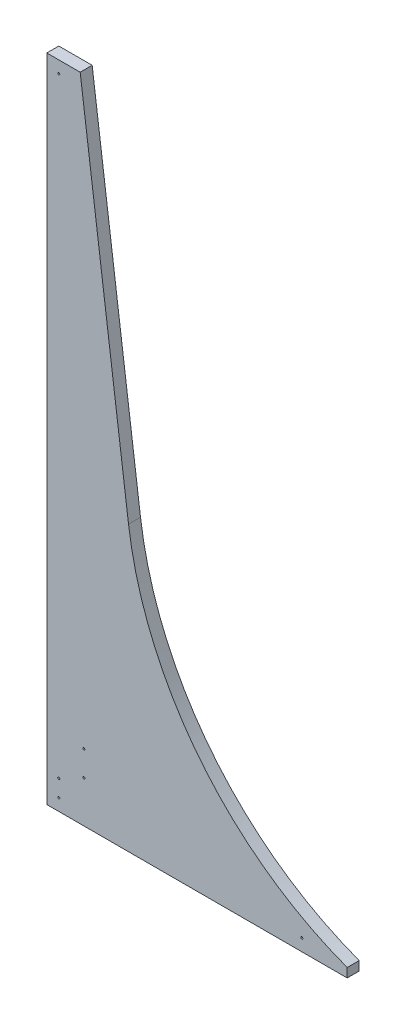
ISO-10303-21;
HEADER;
FILE_DESCRIPTION(('STEP AP214'),'2;1');
FILE_NAME('part.step','',(''),(''),'','','');
FILE_SCHEMA(('AUTOMOTIVE_DESIGN { 1 0 10303 214 1 1 1 1 }'));
ENDSEC;
DATA;
#1=APPLICATION_CONTEXT('core data for automotive mechanical design processes');
#2=APPLICATION_PROTOCOL_DEFINITION('international standard','automotive_design',2000,#1);
#3=PRODUCT_CONTEXT('',#1,'mechanical');
#4=PRODUCT('Part','Part','',(#3));
#5=PRODUCT_RELATED_PRODUCT_CATEGORY('part','',(#4));
#6=PRODUCT_DEFINITION_FORMATION('','',#4);
#7=PRODUCT_DEFINITION_CONTEXT('part definition',#1,'design');
#8=PRODUCT_DEFINITION('design','',#6,#7);
#9=PRODUCT_DEFINITION_SHAPE('','',#8);
#10=(LENGTH_UNIT() NAMED_UNIT(*) SI_UNIT(.MILLI.,.METRE.));
#11=(NAMED_UNIT(*) PLANE_ANGLE_UNIT() SI_UNIT($,.RADIAN.));
#12=(NAMED_UNIT(*) SI_UNIT($,.STERADIAN.) SOLID_ANGLE_UNIT());
#13=UNCERTAINTY_MEASURE_WITH_UNIT(LENGTH_MEASURE(1.E-05),#10,'distance_accuracy_value','');
#14=(GEOMETRIC_REPRESENTATION_CONTEXT(3) GLOBAL_UNCERTAINTY_ASSIGNED_CONTEXT((#13)) GLOBAL_UNIT_ASSIGNED_CONTEXT((#10,
#11,#12)) REPRESENTATION_CONTEXT('',''));
#15=CARTESIAN_POINT('',(0.,0.,0.));
#16=DIRECTION('',(0.,0.,1.));
#17=DIRECTION('',(1.,0.,0.));
#18=AXIS2_PLACEMENT_3D('',#15,#16,#17);
#19=CARTESIAN_POINT('',(638.116559349375,499.436357901165,18.25625));
#20=DIRECTION('',(0.,0.,-1.));
#21=DIRECTION('',(-1.,0.,0.));
#22=AXIS2_PLACEMENT_3D('',#19,#20,#21);
#23=CYLINDRICAL_SURFACE('',#22,518.182264806593);
#24=CARTESIAN_POINT('',(638.116559349375,499.436357901165,0.));
#25=DIRECTION('',(0.,0.,1.));
#26=DIRECTION('',(1.,0.,0.));
#27=AXIS2_PLACEMENT_3D('',#24,#25,#26);
#28=CIRCLE('',#27,518.182264806593);
#29=CARTESIAN_POINT('',(124.367415651835,431.8,0.));
#30=VERTEX_POINT('',#29);
#31=CARTESIAN_POINT('',(457.201,13.8620382080899,0.));
#32=VERTEX_POINT('',#31);
#33=EDGE_CURVE('E142',#30,#32,#28,.T.);
#34=ORIENTED_EDGE('',*,*,#33,.F.);
#35=DIRECTION('',(0.,0.,-1.));
#36=VECTOR('',#35,1.);
#37=CARTESIAN_POINT('',(124.367415651835,431.8,18.25625));
#38=LINE('',#37,#36);
#39=CARTESIAN_POINT('',(124.367415651835,431.8,18.25625));
#40=VERTEX_POINT('',#39);
#41=EDGE_CURVE('E11',#40,#30,#38,.T.);
#42=ORIENTED_EDGE('',*,*,#41,.F.);
#43=CARTESIAN_POINT('',(638.116559349375,499.436357901165,18.25625));
#44=DIRECTION('',(0.,0.,1.));
#45=DIRECTION('',(1.,0.,0.));
#46=AXIS2_PLACEMENT_3D('',#43,#44,#45);
#47=CIRCLE('',#46,518.182264806593);
#48=CARTESIAN_POINT('',(457.201,13.8620382080899,18.25625));
#49=VERTEX_POINT('',#48);
#50=EDGE_CURVE('E174',#40,#49,#47,.T.);
#51=ORIENTED_EDGE('',*,*,#50,.T.);
#52=DIRECTION('',(0.,0.,-1.));
#53=VECTOR('',#52,1.);
#54=CARTESIAN_POINT('',(457.201,13.8620382080899,18.25625));
#55=LINE('',#54,#53);
#56=EDGE_CURVE('E56',#49,#32,#55,.T.);
#57=ORIENTED_EDGE('',*,*,#56,.T.);
#58=EDGE_LOOP('',(#34,#42,#51,#57));
#59=FACE_BOUND('',#58,.T.);
#60=ADVANCED_FACE('F40',(#59),#23,.F.);
#61=CARTESIAN_POINT('',(178.127589027018,23.4509419846275,18.25625));
#62=DIRECTION('',(0.991444861373811,0.130526192220048,0.));
#63=DIRECTION('',(-0.130526192220048,0.991444861373811,0.));
#64=AXIS2_PLACEMENT_3D('',#61,#62,#63);
#65=PLANE('',#64);
#66=DIRECTION('',(0.130526192220048,-0.991444861373811,0.));
#67=VECTOR('',#66,1.);
#68=CARTESIAN_POINT('',(178.127589027018,23.4509419846275,0.));
#69=LINE('',#68,#67);
#70=CARTESIAN_POINT('',(50.8,990.6,0.));
#71=VERTEX_POINT('',#70);
#72=EDGE_CURVE('E144',#71,#30,#69,.T.);
#73=ORIENTED_EDGE('',*,*,#72,.F.);
#74=DIRECTION('',(0.,0.,-1.));
#75=VECTOR('',#74,1.);
#76=CARTESIAN_POINT('',(50.8,990.6,18.25625));
#77=LINE('',#76,#75);
#78=CARTESIAN_POINT('',(50.8,990.6,18.25625));
#79=VERTEX_POINT('',#78);
#80=EDGE_CURVE('E48',#79,#71,#77,.T.);
#81=ORIENTED_EDGE('',*,*,#80,.F.);
#82=DIRECTION('',(0.130526192220048,-0.991444861373811,0.));
#83=VECTOR('',#82,1.);
#84=CARTESIAN_POINT('',(178.127589027018,23.4509419846275,18.25625));
#85=LINE('',#84,#83);
#86=EDGE_CURVE('E119',#79,#40,#85,.T.);
#87=ORIENTED_EDGE('',*,*,#86,.T.);
#88=ORIENTED_EDGE('',*,*,#41,.T.);
#89=EDGE_LOOP('',(#73,#81,#87,#88));
#90=FACE_BOUND('',#89,.T.);
#91=ADVANCED_FACE('F183',(#90),#65,.T.);
#92=CARTESIAN_POINT('',(0.,990.6,18.25625));
#93=DIRECTION('',(0.,1.,0.));
#94=DIRECTION('',(0.,0.,1.));
#95=AXIS2_PLACEMENT_3D('',#92,#93,#94);
#96=PLANE('',#95);
#97=DIRECTION('',(1.,0.,0.));
#98=VECTOR('',#97,1.);
#99=CARTESIAN_POINT('',(0.,990.6,0.));
#100=LINE('',#99,#98);
#101=CARTESIAN_POINT('',(0.,990.6,0.));
#102=VERTEX_POINT('',#101);
#103=EDGE_CURVE('E147',#102,#71,#100,.T.);
#104=ORIENTED_EDGE('',*,*,#103,.F.);
#105=DIRECTION('',(0.,0.,-1.));
#106=VECTOR('',#105,1.);
#107=CARTESIAN_POINT('',(0.,990.6,18.25625));
#108=LINE('',#107,#106);
#109=CARTESIAN_POINT('',(0.,990.6,18.25625));
#110=VERTEX_POINT('',#109);
#111=EDGE_CURVE('E104',#110,#102,#108,.T.);
#112=ORIENTED_EDGE('',*,*,#111,.F.);
#113=DIRECTION('',(1.,0.,0.));
#114=VECTOR('',#113,1.);
#115=CARTESIAN_POINT('',(0.,990.6,18.25625));
#116=LINE('',#115,#114);
#117=EDGE_CURVE('E117',#110,#79,#116,.T.);
#118=ORIENTED_EDGE('',*,*,#117,.T.);
#119=ORIENTED_EDGE('',*,*,#80,.T.);
#120=EDGE_LOOP('',(#104,#112,#118,#119));
#121=FACE_BOUND('',#120,.T.);
#122=ADVANCED_FACE('F180',(#121),#96,.T.);
#123=CARTESIAN_POINT('',(0.,0.,18.25625));
#124=DIRECTION('',(-1.,0.,0.));
#125=DIRECTION('',(0.,0.,1.));
#126=AXIS2_PLACEMENT_3D('',#123,#124,#125);
#127=PLANE('',#126);
#128=DIRECTION('',(0.,1.,0.));
#129=VECTOR('',#128,1.);
#130=CARTESIAN_POINT('',(0.,0.,0.));
#131=LINE('',#130,#129);
#132=CARTESIAN_POINT('',(0.,0.,0.));
#133=VERTEX_POINT('',#132);
#134=EDGE_CURVE('E101',#133,#102,#131,.T.);
#135=ORIENTED_EDGE('',*,*,#134,.F.);
#136=DIRECTION('',(0.,0.,-1.));
#137=VECTOR('',#136,1.);
#138=CARTESIAN_POINT('',(0.,0.,18.25625));
#139=LINE('',#138,#137);
#140=CARTESIAN_POINT('',(0.,0.,18.25625));
#141=VERTEX_POINT('',#140);
#142=EDGE_CURVE('E95',#141,#133,#139,.T.);
#143=ORIENTED_EDGE('',*,*,#142,.F.);
#144=DIRECTION('',(0.,1.,0.));
#145=VECTOR('',#144,1.);
#146=CARTESIAN_POINT('',(0.,0.,18.25625));
#147=LINE('',#146,#145);
#148=EDGE_CURVE('E99',#141,#110,#147,.T.);
#149=ORIENTED_EDGE('',*,*,#148,.T.);
#150=ORIENTED_EDGE('',*,*,#111,.T.);
#151=EDGE_LOOP('',(#135,#143,#149,#150));
#152=FACE_BOUND('',#151,.T.);
#153=ADVANCED_FACE('F97',(#152),#127,.T.);
#154=CARTESIAN_POINT('',(0.,0.,18.25625));
#155=DIRECTION('',(0.,1.,0.));
#156=DIRECTION('',(0.,0.,1.));
#157=AXIS2_PLACEMENT_3D('',#154,#155,#156);
#158=PLANE('',#157);
#159=DIRECTION('',(1.,0.,0.));
#160=VECTOR('',#159,1.);
#161=CARTESIAN_POINT('',(0.,0.,0.));
#162=LINE('',#161,#160);
#163=CARTESIAN_POINT('',(457.201,0.,0.));
#164=VERTEX_POINT('',#163);
#165=EDGE_CURVE('E151',#133,#164,#162,.T.);
#166=ORIENTED_EDGE('',*,*,#165,.T.);
#167=DIRECTION('',(0.,0.,-1.));
#168=VECTOR('',#167,1.);
#169=CARTESIAN_POINT('',(457.201,0.,18.25625));
#170=LINE('',#169,#168);
#171=CARTESIAN_POINT('',(457.201,0.,18.25625));
#172=VERTEX_POINT('',#171);
#173=EDGE_CURVE('E76',#172,#164,#170,.T.);
#174=ORIENTED_EDGE('',*,*,#173,.F.);
#175=DIRECTION('',(1.,0.,0.));
#176=VECTOR('',#175,1.);
#177=CARTESIAN_POINT('',(0.,0.,18.25625));
#178=LINE('',#177,#176);
#179=EDGE_CURVE('E106',#141,#172,#178,.T.);
#180=ORIENTED_EDGE('',*,*,#179,.F.);
#181=ORIENTED_EDGE('',*,*,#142,.T.);
#182=EDGE_LOOP('',(#166,#174,#180,#181));
#183=FACE_BOUND('',#182,.T.);
#184=ADVANCED_FACE('F107',(#183),#158,.F.);
#185=CARTESIAN_POINT('',(388.14375,18.25625,18.25625));
#186=DIRECTION('',(0.,0.,-1.));
#187=DIRECTION('',(-1.,0.,0.));
#188=AXIS2_PLACEMENT_3D('',#185,#186,#187);
#189=CYLINDRICAL_SURFACE('',#188,1.58750000000004);
#190=CARTESIAN_POINT('',(388.14375,18.25625,18.25625));
#191=DIRECTION('',(0.,0.,1.));
#192=DIRECTION('',(1.,0.,0.));
#193=AXIS2_PLACEMENT_3D('',#190,#191,#192);
#194=CIRCLE('',#193,1.58750000000004);
#195=CARTESIAN_POINT('',(389.73125,18.25625,18.25625));
#196=VERTEX_POINT('',#195);
#197=EDGE_CURVE('E136',#196,#196,#194,.T.);
#198=ORIENTED_EDGE('',*,*,#197,.T.);
#199=EDGE_LOOP('',(#198));
#200=FACE_BOUND('',#199,.T.);
#201=CARTESIAN_POINT('',(388.14375,18.25625,0.));
#202=DIRECTION('',(0.,0.,1.));
#203=DIRECTION('',(1.,0.,0.));
#204=AXIS2_PLACEMENT_3D('',#201,#202,#203);
#205=CIRCLE('',#204,1.58750000000004);
#206=CARTESIAN_POINT('',(389.73125,18.25625,0.));
#207=VERTEX_POINT('',#206);
#208=EDGE_CURVE('E168',#207,#207,#205,.T.);
#209=ORIENTED_EDGE('',*,*,#208,.F.);
#210=EDGE_LOOP('',(#209));
#211=FACE_BOUND('',#210,.T.);
#212=ADVANCED_FACE('F213',(#200,#211),#189,.F.);
#213=CARTESIAN_POINT('',(18.25625,972.34375,18.25625));
#214=DIRECTION('',(0.,0.,-1.));
#215=DIRECTION('',(-1.,0.,0.));
#216=AXIS2_PLACEMENT_3D('',#213,#214,#215);
#217=CYLINDRICAL_SURFACE('',#216,1.58750000000001);
#218=CARTESIAN_POINT('',(18.25625,972.34375,18.25625));
#219=DIRECTION('',(0.,0.,1.));
#220=DIRECTION('',(1.,0.,0.));
#221=AXIS2_PLACEMENT_3D('',#218,#219,#220);
#222=CIRCLE('',#221,1.58750000000001);
#223=CARTESIAN_POINT('',(19.84375,972.34375,18.25625));
#224=VERTEX_POINT('',#223);
#225=EDGE_CURVE('E133',#224,#224,#222,.T.);
#226=ORIENTED_EDGE('',*,*,#225,.T.);
#227=EDGE_LOOP('',(#226));
#228=FACE_BOUND('',#227,.T.);
#229=CARTESIAN_POINT('',(18.25625,972.34375,0.));
#230=DIRECTION('',(0.,0.,1.));
#231=DIRECTION('',(1.,0.,0.));
#232=AXIS2_PLACEMENT_3D('',#229,#230,#231);
#233=CIRCLE('',#232,1.58750000000001);
#234=CARTESIAN_POINT('',(19.84375,972.34375,0.));
#235=VERTEX_POINT('',#234);
#236=EDGE_CURVE('E165',#235,#235,#233,.T.);
#237=ORIENTED_EDGE('',*,*,#236,.F.);
#238=EDGE_LOOP('',(#237));
#239=FACE_BOUND('',#238,.T.);
#240=ADVANCED_FACE('F217',(#228,#239),#217,.F.);
#241=CARTESIAN_POINT('',(56.35625,101.6,18.25625));
#242=DIRECTION('',(0.,0.,-1.));
#243=DIRECTION('',(-1.,0.,0.));
#244=AXIS2_PLACEMENT_3D('',#241,#242,#243);
#245=CYLINDRICAL_SURFACE('',#244,1.5875);
#246=CARTESIAN_POINT('',(56.35625,101.6,18.25625));
#247=DIRECTION('',(0.,0.,1.));
#248=DIRECTION('',(1.,0.,0.));
#249=AXIS2_PLACEMENT_3D('',#246,#247,#248);
#250=CIRCLE('',#249,1.5875);
#251=CARTESIAN_POINT('',(57.94375,101.6,18.25625));
#252=VERTEX_POINT('',#251);
#253=EDGE_CURVE('E130',#252,#252,#250,.T.);
#254=ORIENTED_EDGE('',*,*,#253,.T.);
#255=EDGE_LOOP('',(#254));
#256=FACE_BOUND('',#255,.T.);
#257=CARTESIAN_POINT('',(56.35625,101.6,0.));
#258=DIRECTION('',(0.,0.,1.));
#259=DIRECTION('',(1.,0.,0.));
#260=AXIS2_PLACEMENT_3D('',#257,#258,#259);
#261=CIRCLE('',#260,1.5875);
#262=CARTESIAN_POINT('',(57.94375,101.6,0.));
#263=VERTEX_POINT('',#262);
#264=EDGE_CURVE('E162',#263,#263,#261,.T.);
#265=ORIENTED_EDGE('',*,*,#264,.F.);
#266=EDGE_LOOP('',(#265));
#267=FACE_BOUND('',#266,.T.);
#268=ADVANCED_FACE('F223',(#256,#267),#245,.F.);
#269=CARTESIAN_POINT('',(18.25625,43.65625,18.25625));
#270=DIRECTION('',(0.,0.,-1.));
#271=DIRECTION('',(-1.,0.,0.));
#272=AXIS2_PLACEMENT_3D('',#269,#270,#271);
#273=CYLINDRICAL_SURFACE('',#272,1.5875);
#274=CARTESIAN_POINT('',(18.25625,43.65625,18.25625));
#275=DIRECTION('',(0.,0.,1.));
#276=DIRECTION('',(1.,0.,0.));
#277=AXIS2_PLACEMENT_3D('',#274,#275,#276);
#278=CIRCLE('',#277,1.5875);
#279=CARTESIAN_POINT('',(19.84375,43.65625,18.25625));
#280=VERTEX_POINT('',#279);
#281=EDGE_CURVE('E127',#280,#280,#278,.T.);
#282=ORIENTED_EDGE('',*,*,#281,.T.);
#283=EDGE_LOOP('',(#282));
#284=FACE_BOUND('',#283,.T.);
#285=CARTESIAN_POINT('',(18.25625,43.65625,0.));
#286=DIRECTION('',(0.,0.,1.));
#287=DIRECTION('',(1.,0.,0.));
#288=AXIS2_PLACEMENT_3D('',#285,#286,#287);
#289=CIRCLE('',#288,1.5875);
#290=CARTESIAN_POINT('',(19.84375,43.65625,0.));
#291=VERTEX_POINT('',#290);
#292=EDGE_CURVE('E159',#291,#291,#289,.T.);
#293=ORIENTED_EDGE('',*,*,#292,.F.);
#294=EDGE_LOOP('',(#293));
#295=FACE_BOUND('',#294,.T.);
#296=ADVANCED_FACE('F198',(#284,#295),#273,.F.);
#297=CARTESIAN_POINT('',(56.35625,63.5,18.25625));
#298=DIRECTION('',(0.,0.,-1.));
#299=DIRECTION('',(-1.,0.,0.));
#300=AXIS2_PLACEMENT_3D('',#297,#298,#299);
#301=CYLINDRICAL_SURFACE('',#300,1.5875);
#302=CARTESIAN_POINT('',(56.35625,63.5,18.25625));
#303=DIRECTION('',(0.,0.,1.));
#304=DIRECTION('',(1.,0.,0.));
#305=AXIS2_PLACEMENT_3D('',#302,#303,#304);
#306=CIRCLE('',#305,1.5875);
#307=CARTESIAN_POINT('',(57.94375,63.5,18.25625));
#308=VERTEX_POINT('',#307);
#309=EDGE_CURVE('E124',#308,#308,#306,.T.);
#310=ORIENTED_EDGE('',*,*,#309,.T.);
#311=EDGE_LOOP('',(#310));
#312=FACE_BOUND('',#311,.T.);
#313=CARTESIAN_POINT('',(56.35625,63.5,0.));
#314=DIRECTION('',(0.,0.,1.));
#315=DIRECTION('',(1.,0.,0.));
#316=AXIS2_PLACEMENT_3D('',#313,#314,#315);
#317=CIRCLE('',#316,1.5875);
#318=CARTESIAN_POINT('',(57.94375,63.5,0.));
#319=VERTEX_POINT('',#318);
#320=EDGE_CURVE('E156',#319,#319,#317,.T.);
#321=ORIENTED_EDGE('',*,*,#320,.F.);
#322=EDGE_LOOP('',(#321));
#323=FACE_BOUND('',#322,.T.);
#324=ADVANCED_FACE('F190',(#312,#323),#301,.F.);
#325=CARTESIAN_POINT('',(457.201,0.,18.25625));
#326=DIRECTION('',(1.,0.,0.));
#327=DIRECTION('',(0.,0.,-1.));
#328=AXIS2_PLACEMENT_3D('',#325,#326,#327);
#329=PLANE('',#328);
#330=DIRECTION('',(0.,-1.,0.));
#331=VECTOR('',#330,1.);
#332=CARTESIAN_POINT('',(457.201,0.,0.));
#333=LINE('',#332,#331);
#334=EDGE_CURVE('E153',#32,#164,#333,.T.);
#335=ORIENTED_EDGE('',*,*,#334,.F.);
#336=ORIENTED_EDGE('',*,*,#56,.F.);
#337=DIRECTION('',(0.,-1.,0.));
#338=VECTOR('',#337,1.);
#339=CARTESIAN_POINT('',(457.201,0.,18.25625));
#340=LINE('',#339,#338);
#341=EDGE_CURVE('E110',#49,#172,#340,.T.);
#342=ORIENTED_EDGE('',*,*,#341,.T.);
#343=ORIENTED_EDGE('',*,*,#173,.T.);
#344=EDGE_LOOP('',(#335,#336,#342,#343));
#345=FACE_BOUND('',#344,.T.);
#346=ADVANCED_FACE('F187',(#345),#329,.T.);
#347=CARTESIAN_POINT('',(18.25625,18.25625,18.25625));
#348=DIRECTION('',(0.,0.,-1.));
#349=DIRECTION('',(-1.,0.,0.));
#350=AXIS2_PLACEMENT_3D('',#347,#348,#349);
#351=CYLINDRICAL_SURFACE('',#350,1.5875);
#352=CARTESIAN_POINT('',(18.25625,18.25625,18.25625));
#353=DIRECTION('',(0.,0.,1.));
#354=DIRECTION('',(1.,0.,0.));
#355=AXIS2_PLACEMENT_3D('',#352,#353,#354);
#356=CIRCLE('',#355,1.5875);
#357=CARTESIAN_POINT('',(19.84375,18.25625,18.25625));
#358=VERTEX_POINT('',#357);
#359=EDGE_CURVE('E139',#358,#358,#356,.T.);
#360=ORIENTED_EDGE('',*,*,#359,.T.);
#361=EDGE_LOOP('',(#360));
#362=FACE_BOUND('',#361,.T.);
#363=CARTESIAN_POINT('',(18.25625,18.25625,0.));
#364=DIRECTION('',(0.,0.,1.));
#365=DIRECTION('',(1.,0.,0.));
#366=AXIS2_PLACEMENT_3D('',#363,#364,#365);
#367=CIRCLE('',#366,1.5875);
#368=CARTESIAN_POINT('',(19.84375,18.25625,0.));
#369=VERTEX_POINT('',#368);
#370=EDGE_CURVE('E171',#369,#369,#367,.T.);
#371=ORIENTED_EDGE('',*,*,#370,.F.);
#372=EDGE_LOOP('',(#371));
#373=FACE_BOUND('',#372,.T.);
#374=ADVANCED_FACE('F189',(#362,#373),#351,.F.);
#375=CARTESIAN_POINT('',(0.,0.,18.25625));
#376=DIRECTION('',(0.,0.,1.));
#377=DIRECTION('',(1.,0.,0.));
#378=AXIS2_PLACEMENT_3D('',#375,#376,#377);
#379=PLANE('',#378);
#380=ORIENTED_EDGE('',*,*,#50,.F.);
#381=ORIENTED_EDGE('',*,*,#86,.F.);
#382=ORIENTED_EDGE('',*,*,#117,.F.);
#383=ORIENTED_EDGE('',*,*,#148,.F.);
#384=ORIENTED_EDGE('',*,*,#179,.T.);
#385=ORIENTED_EDGE('',*,*,#341,.F.);
#386=EDGE_LOOP('',(#380,#381,#382,#383,#384,#385));
#387=FACE_BOUND('',#386,.T.);
#388=ORIENTED_EDGE('',*,*,#309,.F.);
#389=EDGE_LOOP('',(#388));
#390=FACE_BOUND('',#389,.T.);
#391=ORIENTED_EDGE('',*,*,#281,.F.);
#392=EDGE_LOOP('',(#391));
#393=FACE_BOUND('',#392,.T.);
#394=ORIENTED_EDGE('',*,*,#253,.F.);
#395=EDGE_LOOP('',(#394));
#396=FACE_BOUND('',#395,.T.);
#397=ORIENTED_EDGE('',*,*,#225,.F.);
#398=EDGE_LOOP('',(#397));
#399=FACE_BOUND('',#398,.T.);
#400=ORIENTED_EDGE('',*,*,#197,.F.);
#401=EDGE_LOOP('',(#400));
#402=FACE_BOUND('',#401,.T.);
#403=ORIENTED_EDGE('',*,*,#359,.F.);
#404=EDGE_LOOP('',(#403));
#405=FACE_BOUND('',#404,.T.);
#406=ADVANCED_FACE('F113',(#387,#390,#393,#396,#399,#402,#405),#379,.T.);
#407=CARTESIAN_POINT('',(0.,0.,0.));
#408=DIRECTION('',(0.,0.,1.));
#409=DIRECTION('',(1.,0.,0.));
#410=AXIS2_PLACEMENT_3D('',#407,#408,#409);
#411=PLANE('',#410);
#412=ORIENTED_EDGE('',*,*,#33,.T.);
#413=ORIENTED_EDGE('',*,*,#334,.T.);
#414=ORIENTED_EDGE('',*,*,#165,.F.);
#415=ORIENTED_EDGE('',*,*,#134,.T.);
#416=ORIENTED_EDGE('',*,*,#103,.T.);
#417=ORIENTED_EDGE('',*,*,#72,.T.);
#418=EDGE_LOOP('',(#412,#413,#414,#415,#416,#417));
#419=FACE_BOUND('',#418,.T.);
#420=ORIENTED_EDGE('',*,*,#320,.T.);
#421=EDGE_LOOP('',(#420));
#422=FACE_BOUND('',#421,.T.);
#423=ORIENTED_EDGE('',*,*,#292,.T.);
#424=EDGE_LOOP('',(#423));
#425=FACE_BOUND('',#424,.T.);
#426=ORIENTED_EDGE('',*,*,#264,.T.);
#427=EDGE_LOOP('',(#426));
#428=FACE_BOUND('',#427,.T.);
#429=ORIENTED_EDGE('',*,*,#236,.T.);
#430=EDGE_LOOP('',(#429));
#431=FACE_BOUND('',#430,.T.);
#432=ORIENTED_EDGE('',*,*,#208,.T.);
#433=EDGE_LOOP('',(#432));
#434=FACE_BOUND('',#433,.T.);
#435=ORIENTED_EDGE('',*,*,#370,.T.);
#436=EDGE_LOOP('',(#435));
#437=FACE_BOUND('',#436,.T.);
#438=ADVANCED_FACE('F185',(#419,#422,#425,#428,#431,#434,#437),#411,.F.);
#439=CLOSED_SHELL('',(#60,#91,#122,#153,#184,#212,#240,#268,#296,#324,#346,#374,#406,#438));
#440=MANIFOLD_SOLID_BREP('B2',#439);
#441=ADVANCED_BREP_SHAPE_REPRESENTATION('',(#18,#440),#14);
#442=SHAPE_DEFINITION_REPRESENTATION(#9,#441);
ENDSEC;
END-ISO-10303-21;
